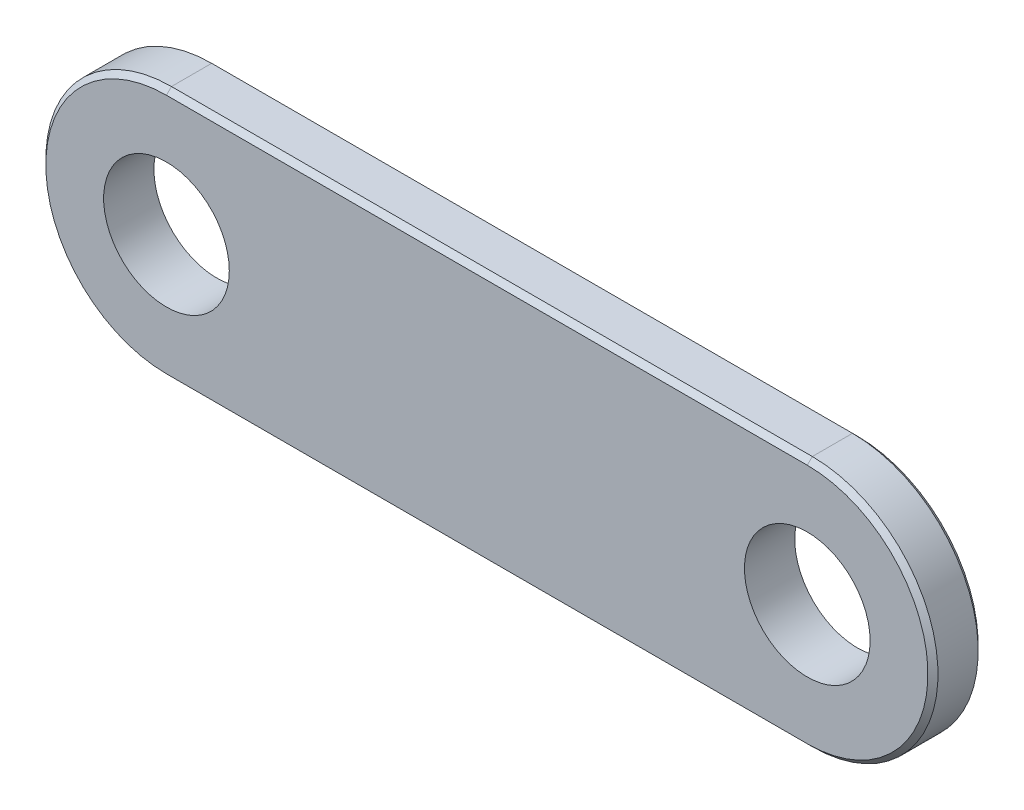
ISO-10303-21;
HEADER;
FILE_DESCRIPTION(('STEP AP214'),'2;1');
FILE_NAME('part.step','',(''),(''),'','','');
FILE_SCHEMA(('AUTOMOTIVE_DESIGN { 1 0 10303 214 1 1 1 1 }'));
ENDSEC;
DATA;
#1=APPLICATION_CONTEXT('core data for automotive mechanical design processes');
#2=APPLICATION_PROTOCOL_DEFINITION('international standard','automotive_design',2000,#1);
#3=PRODUCT_CONTEXT('',#1,'mechanical');
#4=PRODUCT('Part','Part','',(#3));
#5=PRODUCT_RELATED_PRODUCT_CATEGORY('part','',(#4));
#6=PRODUCT_DEFINITION_FORMATION('','',#4);
#7=PRODUCT_DEFINITION_CONTEXT('part definition',#1,'design');
#8=PRODUCT_DEFINITION('design','',#6,#7);
#9=PRODUCT_DEFINITION_SHAPE('','',#8);
#10=(LENGTH_UNIT() NAMED_UNIT(*) SI_UNIT(.MILLI.,.METRE.));
#11=(NAMED_UNIT(*) PLANE_ANGLE_UNIT() SI_UNIT($,.RADIAN.));
#12=(NAMED_UNIT(*) SI_UNIT($,.STERADIAN.) SOLID_ANGLE_UNIT());
#13=UNCERTAINTY_MEASURE_WITH_UNIT(LENGTH_MEASURE(1.E-05),#10,'distance_accuracy_value','');
#14=(GEOMETRIC_REPRESENTATION_CONTEXT(3) GLOBAL_UNCERTAINTY_ASSIGNED_CONTEXT((#13)) GLOBAL_UNIT_ASSIGNED_CONTEXT((#10,
#11,#12)) REPRESENTATION_CONTEXT('',''));
#15=CARTESIAN_POINT('',(0.,0.,0.));
#16=DIRECTION('',(0.,0.,1.));
#17=DIRECTION('',(1.,0.,0.));
#18=AXIS2_PLACEMENT_3D('',#15,#16,#17);
#19=CARTESIAN_POINT('',(-127.5,0.,20.));
#20=DIRECTION('',(0.,0.,1.));
#21=DIRECTION('',(1.,0.,0.));
#22=AXIS2_PLACEMENT_3D('',#19,#20,#21);
#23=PLANE('',#22);
#24=DIRECTION('',(1.,0.,0.));
#25=VECTOR('',#24,1.);
#26=CARTESIAN_POINT('',(127.5,-47.9999999999999,20.));
#27=LINE('',#26,#25);
#28=CARTESIAN_POINT('',(-127.5,-47.9999999999999,20.));
#29=VERTEX_POINT('',#28);
#30=CARTESIAN_POINT('',(127.5,-47.9999999999999,20.));
#31=VERTEX_POINT('',#30);
#32=EDGE_CURVE('E114',#29,#31,#27,.T.);
#33=ORIENTED_EDGE('',*,*,#32,.T.);
#34=CARTESIAN_POINT('',(127.5,0.,20.));
#35=DIRECTION('',(0.,0.,1.));
#36=DIRECTION('',(1.,0.,0.));
#37=AXIS2_PLACEMENT_3D('',#34,#35,#36);
#38=CIRCLE('',#37,48.);
#39=CARTESIAN_POINT('',(127.5,48.,20.));
#40=VERTEX_POINT('',#39);
#41=EDGE_CURVE('E110',#31,#40,#38,.T.);
#42=ORIENTED_EDGE('',*,*,#41,.T.);
#43=DIRECTION('',(-1.,0.,0.));
#44=VECTOR('',#43,1.);
#45=CARTESIAN_POINT('',(-127.5,48.,20.));
#46=LINE('',#45,#44);
#47=CARTESIAN_POINT('',(-127.5,47.9999999999999,20.));
#48=VERTEX_POINT('',#47);
#49=EDGE_CURVE('E104',#40,#48,#46,.T.);
#50=ORIENTED_EDGE('',*,*,#49,.T.);
#51=CARTESIAN_POINT('',(-127.5,0.,20.));
#52=DIRECTION('',(0.,0.,1.));
#53=DIRECTION('',(1.,0.,0.));
#54=AXIS2_PLACEMENT_3D('',#51,#52,#53);
#55=CIRCLE('',#54,47.9999999999999);
#56=EDGE_CURVE('E107',#48,#29,#55,.T.);
#57=ORIENTED_EDGE('',*,*,#56,.T.);
#58=EDGE_LOOP('',(#33,#42,#50,#57));
#59=FACE_BOUND('',#58,.T.);
#60=CARTESIAN_POINT('',(-127.5,0.,20.));
#61=DIRECTION('',(0.,0.,1.));
#62=DIRECTION('',(1.,0.,0.));
#63=AXIS2_PLACEMENT_3D('',#60,#61,#62);
#64=CIRCLE('',#63,25.);
#65=CARTESIAN_POINT('',(-102.5,0.,20.));
#66=VERTEX_POINT('',#65);
#67=EDGE_CURVE('E186',#66,#66,#64,.T.);
#68=ORIENTED_EDGE('',*,*,#67,.F.);
#69=EDGE_LOOP('',(#68));
#70=FACE_BOUND('',#69,.T.);
#71=CARTESIAN_POINT('',(127.5,0.,20.));
#72=DIRECTION('',(0.,0.,1.));
#73=DIRECTION('',(1.,0.,0.));
#74=AXIS2_PLACEMENT_3D('',#71,#72,#73);
#75=CIRCLE('',#74,25.);
#76=CARTESIAN_POINT('',(152.5,0.,20.));
#77=VERTEX_POINT('',#76);
#78=EDGE_CURVE('E190',#77,#77,#75,.T.);
#79=ORIENTED_EDGE('',*,*,#78,.F.);
#80=EDGE_LOOP('',(#79));
#81=FACE_BOUND('',#80,.T.);
#82=ADVANCED_FACE('F37',(#59,#70,#81),#23,.T.);
#83=CARTESIAN_POINT('',(-127.5,0.,0.));
#84=DIRECTION('',(0.,0.,1.));
#85=DIRECTION('',(1.,0.,0.));
#86=AXIS2_PLACEMENT_3D('',#83,#84,#85);
#87=PLANE('',#86);
#88=DIRECTION('',(1.,0.,0.));
#89=VECTOR('',#88,1.);
#90=CARTESIAN_POINT('',(-127.5,48.,0.));
#91=LINE('',#90,#89);
#92=CARTESIAN_POINT('',(-127.5,47.9999999999999,0.));
#93=VERTEX_POINT('',#92);
#94=CARTESIAN_POINT('',(127.5,48.,0.));
#95=VERTEX_POINT('',#94);
#96=EDGE_CURVE('E46',#93,#95,#91,.T.);
#97=ORIENTED_EDGE('',*,*,#96,.T.);
#98=CARTESIAN_POINT('',(127.5,0.,0.));
#99=DIRECTION('',(0.,0.,1.));
#100=DIRECTION('',(1.,0.,0.));
#101=AXIS2_PLACEMENT_3D('',#98,#99,#100);
#102=CIRCLE('',#101,48.);
#103=CARTESIAN_POINT('',(127.5,-47.9999999999999,0.));
#104=VERTEX_POINT('',#103);
#105=EDGE_CURVE('E11',#95,#104,#102,.F.);
#106=ORIENTED_EDGE('',*,*,#105,.T.);
#107=DIRECTION('',(-1.,0.,0.));
#108=VECTOR('',#107,1.);
#109=CARTESIAN_POINT('',(-127.5,-47.9999999999999,0.));
#110=LINE('',#109,#108);
#111=CARTESIAN_POINT('',(-127.5,-47.9999999999999,0.));
#112=VERTEX_POINT('',#111);
#113=EDGE_CURVE('E152',#104,#112,#110,.T.);
#114=ORIENTED_EDGE('',*,*,#113,.T.);
#115=CARTESIAN_POINT('',(-127.5,0.,0.));
#116=DIRECTION('',(0.,0.,1.));
#117=DIRECTION('',(1.,0.,0.));
#118=AXIS2_PLACEMENT_3D('',#115,#116,#117);
#119=CIRCLE('',#118,47.9999999999999);
#120=EDGE_CURVE('E154',#112,#93,#119,.F.);
#121=ORIENTED_EDGE('',*,*,#120,.T.);
#122=EDGE_LOOP('',(#97,#106,#114,#121));
#123=FACE_BOUND('',#122,.T.);
#124=CARTESIAN_POINT('',(-127.5,0.,0.));
#125=DIRECTION('',(0.,0.,1.));
#126=DIRECTION('',(1.,0.,0.));
#127=AXIS2_PLACEMENT_3D('',#124,#125,#126);
#128=CIRCLE('',#127,25.);
#129=CARTESIAN_POINT('',(-102.5,0.,0.));
#130=VERTEX_POINT('',#129);
#131=EDGE_CURVE('E187',#130,#130,#128,.T.);
#132=ORIENTED_EDGE('',*,*,#131,.T.);
#133=EDGE_LOOP('',(#132));
#134=FACE_BOUND('',#133,.T.);
#135=CARTESIAN_POINT('',(127.5,0.,0.));
#136=DIRECTION('',(0.,0.,1.));
#137=DIRECTION('',(1.,0.,0.));
#138=AXIS2_PLACEMENT_3D('',#135,#136,#137);
#139=CIRCLE('',#138,25.);
#140=CARTESIAN_POINT('',(152.5,0.,0.));
#141=VERTEX_POINT('',#140);
#142=EDGE_CURVE('E131',#141,#141,#139,.T.);
#143=ORIENTED_EDGE('',*,*,#142,.T.);
#144=EDGE_LOOP('',(#143));
#145=FACE_BOUND('',#144,.T.);
#146=ADVANCED_FACE('F202',(#123,#134,#145),#87,.F.);
#147=CARTESIAN_POINT('',(-127.5,0.,20.));
#148=DIRECTION('',(0.,0.,-1.));
#149=DIRECTION('',(-1.,0.,0.));
#150=AXIS2_PLACEMENT_3D('',#147,#148,#149);
#151=CYLINDRICAL_SURFACE('',#150,50.);
#152=DIRECTION('',(0.,0.,-1.));
#153=VECTOR('',#152,1.);
#154=CARTESIAN_POINT('',(-127.5,-50.,20.));
#155=LINE('',#154,#153);
#156=CARTESIAN_POINT('',(-127.5,-50.,18.));
#157=VERTEX_POINT('',#156);
#158=CARTESIAN_POINT('',(-127.5,-50.,2.00000000000004));
#159=VERTEX_POINT('',#158);
#160=EDGE_CURVE('E125',#157,#159,#155,.T.);
#161=ORIENTED_EDGE('',*,*,#160,.F.);
#162=CARTESIAN_POINT('',(-127.5,0.,18.));
#163=DIRECTION('',(0.,0.,1.));
#164=DIRECTION('',(1.,0.,0.));
#165=AXIS2_PLACEMENT_3D('',#162,#163,#164);
#166=CIRCLE('',#165,50.);
#167=CARTESIAN_POINT('',(-127.5,50.,18.));
#168=VERTEX_POINT('',#167);
#169=EDGE_CURVE('E156',#157,#168,#166,.F.);
#170=ORIENTED_EDGE('',*,*,#169,.T.);
#171=DIRECTION('',(0.,0.,-1.));
#172=VECTOR('',#171,1.);
#173=CARTESIAN_POINT('',(-127.5,50.,20.));
#174=LINE('',#173,#172);
#175=CARTESIAN_POINT('',(-127.5,50.,2.00000000000004));
#176=VERTEX_POINT('',#175);
#177=EDGE_CURVE('E183',#168,#176,#174,.T.);
#178=ORIENTED_EDGE('',*,*,#177,.T.);
#179=CARTESIAN_POINT('',(-127.5,0.,2.00000000000004));
#180=DIRECTION('',(0.,0.,1.));
#181=DIRECTION('',(1.,0.,0.));
#182=AXIS2_PLACEMENT_3D('',#179,#180,#181);
#183=CIRCLE('',#182,50.);
#184=EDGE_CURVE('E158',#176,#159,#183,.T.);
#185=ORIENTED_EDGE('',*,*,#184,.T.);
#186=EDGE_LOOP('',(#161,#170,#178,#185));
#187=FACE_BOUND('',#186,.T.);
#188=ADVANCED_FACE('F207',(#187),#151,.T.);
#189=CARTESIAN_POINT('',(-127.5,-50.,20.));
#190=DIRECTION('',(0.,1.,0.));
#191=DIRECTION('',(0.,0.,1.));
#192=AXIS2_PLACEMENT_3D('',#189,#190,#191);
#193=PLANE('',#192);
#194=DIRECTION('',(0.,0.,-1.));
#195=VECTOR('',#194,1.);
#196=CARTESIAN_POINT('',(127.5,-50.,20.));
#197=LINE('',#196,#195);
#198=CARTESIAN_POINT('',(127.5,-50.,18.));
#199=VERTEX_POINT('',#198);
#200=CARTESIAN_POINT('',(127.5,-50.,2.00000000000004));
#201=VERTEX_POINT('',#200);
#202=EDGE_CURVE('E177',#199,#201,#197,.T.);
#203=ORIENTED_EDGE('',*,*,#202,.F.);
#204=DIRECTION('',(-1.,0.,0.));
#205=VECTOR('',#204,1.);
#206=CARTESIAN_POINT('',(-127.5,-50.,18.));
#207=LINE('',#206,#205);
#208=EDGE_CURVE('E160',#199,#157,#207,.T.);
#209=ORIENTED_EDGE('',*,*,#208,.T.);
#210=ORIENTED_EDGE('',*,*,#160,.T.);
#211=DIRECTION('',(1.,0.,0.));
#212=VECTOR('',#211,1.);
#213=CARTESIAN_POINT('',(-127.5,-50.,2.00000000000004));
#214=LINE('',#213,#212);
#215=EDGE_CURVE('E162',#159,#201,#214,.T.);
#216=ORIENTED_EDGE('',*,*,#215,.T.);
#217=EDGE_LOOP('',(#203,#209,#210,#216));
#218=FACE_BOUND('',#217,.T.);
#219=ADVANCED_FACE('F220',(#218),#193,.F.);
#220=CARTESIAN_POINT('',(127.5,0.,20.));
#221=DIRECTION('',(0.,0.,-1.));
#222=DIRECTION('',(-1.,0.,0.));
#223=AXIS2_PLACEMENT_3D('',#220,#221,#222);
#224=CYLINDRICAL_SURFACE('',#223,50.);
#225=DIRECTION('',(0.,0.,-1.));
#226=VECTOR('',#225,1.);
#227=CARTESIAN_POINT('',(127.5,50.0000000000001,20.));
#228=LINE('',#227,#226);
#229=CARTESIAN_POINT('',(127.5,50.0000000000001,18.));
#230=VERTEX_POINT('',#229);
#231=CARTESIAN_POINT('',(127.5,50.0000000000001,2.00000000000004));
#232=VERTEX_POINT('',#231);
#233=EDGE_CURVE('E180',#230,#232,#228,.T.);
#234=ORIENTED_EDGE('',*,*,#233,.F.);
#235=CARTESIAN_POINT('',(127.5,0.,18.));
#236=DIRECTION('',(0.,0.,1.));
#237=DIRECTION('',(1.,0.,0.));
#238=AXIS2_PLACEMENT_3D('',#235,#236,#237);
#239=CIRCLE('',#238,50.);
#240=EDGE_CURVE('E167',#230,#199,#239,.F.);
#241=ORIENTED_EDGE('',*,*,#240,.T.);
#242=ORIENTED_EDGE('',*,*,#202,.T.);
#243=CARTESIAN_POINT('',(127.5,0.,2.00000000000004));
#244=DIRECTION('',(0.,0.,1.));
#245=DIRECTION('',(1.,0.,0.));
#246=AXIS2_PLACEMENT_3D('',#243,#244,#245);
#247=CIRCLE('',#246,50.);
#248=EDGE_CURVE('E170',#201,#232,#247,.T.);
#249=ORIENTED_EDGE('',*,*,#248,.T.);
#250=EDGE_LOOP('',(#234,#241,#242,#249));
#251=FACE_BOUND('',#250,.T.);
#252=ADVANCED_FACE('F216',(#251),#224,.T.);
#253=CARTESIAN_POINT('',(-127.5,50.,20.));
#254=DIRECTION('',(0.,-1.,0.));
#255=DIRECTION('',(1.,0.,0.));
#256=AXIS2_PLACEMENT_3D('',#253,#254,#255);
#257=PLANE('',#256);
#258=ORIENTED_EDGE('',*,*,#177,.F.);
#259=DIRECTION('',(1.,0.,0.));
#260=VECTOR('',#259,1.);
#261=CARTESIAN_POINT('',(127.5,50.0000000000001,18.));
#262=LINE('',#261,#260);
#263=EDGE_CURVE('E128',#168,#230,#262,.T.);
#264=ORIENTED_EDGE('',*,*,#263,.T.);
#265=ORIENTED_EDGE('',*,*,#233,.T.);
#266=DIRECTION('',(-1.,0.,0.));
#267=VECTOR('',#266,1.);
#268=CARTESIAN_POINT('',(-127.5,50.,2.00000000000004));
#269=LINE('',#268,#267);
#270=EDGE_CURVE('E165',#232,#176,#269,.T.);
#271=ORIENTED_EDGE('',*,*,#270,.T.);
#272=EDGE_LOOP('',(#258,#264,#265,#271));
#273=FACE_BOUND('',#272,.T.);
#274=ADVANCED_FACE('F213',(#273),#257,.F.);
#275=CARTESIAN_POINT('',(-127.5,0.,20.));
#276=DIRECTION('',(0.,0.,-1.));
#277=DIRECTION('',(-1.,0.,0.));
#278=AXIS2_PLACEMENT_3D('',#275,#276,#277);
#279=CYLINDRICAL_SURFACE('',#278,25.);
#280=ORIENTED_EDGE('',*,*,#67,.T.);
#281=EDGE_LOOP('',(#280));
#282=FACE_BOUND('',#281,.T.);
#283=ORIENTED_EDGE('',*,*,#131,.F.);
#284=EDGE_LOOP('',(#283));
#285=FACE_BOUND('',#284,.T.);
#286=ADVANCED_FACE('F210',(#282,#285),#279,.F.);
#287=CARTESIAN_POINT('',(127.5,0.,20.));
#288=DIRECTION('',(0.,0.,-1.));
#289=DIRECTION('',(-1.,0.,0.));
#290=AXIS2_PLACEMENT_3D('',#287,#288,#289);
#291=CYLINDRICAL_SURFACE('',#290,25.);
#292=ORIENTED_EDGE('',*,*,#78,.T.);
#293=EDGE_LOOP('',(#292));
#294=FACE_BOUND('',#293,.T.);
#295=ORIENTED_EDGE('',*,*,#142,.F.);
#296=EDGE_LOOP('',(#295));
#297=FACE_BOUND('',#296,.T.);
#298=ADVANCED_FACE('F198',(#294,#297),#291,.F.);
#299=CARTESIAN_POINT('',(-127.5,0.,20.));
#300=DIRECTION('',(0.,0.,-1.));
#301=DIRECTION('',(-1.,0.,0.));
#302=AXIS2_PLACEMENT_3D('',#299,#300,#301);
#303=CONICAL_SURFACE('',#302,47.9999999999999,0.78539816339746);
#304=DIRECTION('',(0.,-0.707106781186556,0.707106781186539));
#305=VECTOR('',#304,1.);
#306=CARTESIAN_POINT('',(-127.5,50.,18.));
#307=LINE('',#306,#305);
#308=EDGE_CURVE('E120',#168,#48,#307,.T.);
#309=ORIENTED_EDGE('',*,*,#308,.F.);
#310=ORIENTED_EDGE('',*,*,#169,.F.);
#311=DIRECTION('',(0.,-0.707106781186556,-0.707106781186539));
#312=VECTOR('',#311,1.);
#313=CARTESIAN_POINT('',(-127.5,-47.9999999999999,20.));
#314=LINE('',#313,#312);
#315=EDGE_CURVE('E123',#29,#157,#314,.T.);
#316=ORIENTED_EDGE('',*,*,#315,.F.);
#317=ORIENTED_EDGE('',*,*,#56,.F.);
#318=EDGE_LOOP('',(#309,#310,#316,#317));
#319=FACE_BOUND('',#318,.T.);
#320=ADVANCED_FACE('F118',(#319),#303,.T.);
#321=CARTESIAN_POINT('',(-127.5,-47.9999999999999,20.));
#322=DIRECTION('',(0.,-0.707106781186539,0.707106781186556));
#323=DIRECTION('',(-1.,0.,0.));
#324=AXIS2_PLACEMENT_3D('',#321,#322,#323);
#325=PLANE('',#324);
#326=ORIENTED_EDGE('',*,*,#315,.T.);
#327=ORIENTED_EDGE('',*,*,#208,.F.);
#328=DIRECTION('',(0.,-0.707106781186556,-0.707106781186539));
#329=VECTOR('',#328,1.);
#330=CARTESIAN_POINT('',(127.5,-47.9999999999999,20.));
#331=LINE('',#330,#329);
#332=EDGE_CURVE('E129',#31,#199,#331,.T.);
#333=ORIENTED_EDGE('',*,*,#332,.F.);
#334=ORIENTED_EDGE('',*,*,#32,.F.);
#335=EDGE_LOOP('',(#326,#327,#333,#334));
#336=FACE_BOUND('',#335,.T.);
#337=ADVANCED_FACE('F233',(#336),#325,.T.);
#338=CARTESIAN_POINT('',(-127.5,48.,20.));
#339=DIRECTION('',(0.,0.707106781186539,0.707106781186556));
#340=DIRECTION('',(1.,0.,0.));
#341=AXIS2_PLACEMENT_3D('',#338,#339,#340);
#342=PLANE('',#341);
#343=ORIENTED_EDGE('',*,*,#308,.T.);
#344=ORIENTED_EDGE('',*,*,#49,.F.);
#345=DIRECTION('',(0.,-0.707106781186556,0.707106781186539));
#346=VECTOR('',#345,1.);
#347=CARTESIAN_POINT('',(127.5,50.0000000000001,18.));
#348=LINE('',#347,#346);
#349=EDGE_CURVE('E133',#230,#40,#348,.T.);
#350=ORIENTED_EDGE('',*,*,#349,.F.);
#351=ORIENTED_EDGE('',*,*,#263,.F.);
#352=EDGE_LOOP('',(#343,#344,#350,#351));
#353=FACE_BOUND('',#352,.T.);
#354=ADVANCED_FACE('F127',(#353),#342,.T.);
#355=CARTESIAN_POINT('',(127.5,0.,20.));
#356=DIRECTION('',(0.,0.,-1.));
#357=DIRECTION('',(-1.,0.,0.));
#358=AXIS2_PLACEMENT_3D('',#355,#356,#357);
#359=CONICAL_SURFACE('',#358,48.,0.78539816339746);
#360=ORIENTED_EDGE('',*,*,#332,.T.);
#361=ORIENTED_EDGE('',*,*,#240,.F.);
#362=ORIENTED_EDGE('',*,*,#349,.T.);
#363=ORIENTED_EDGE('',*,*,#41,.F.);
#364=EDGE_LOOP('',(#360,#361,#362,#363));
#365=FACE_BOUND('',#364,.T.);
#366=ADVANCED_FACE('F228',(#365),#359,.T.);
#367=CARTESIAN_POINT('',(-127.5,0.,2.00000000000004));
#368=DIRECTION('',(0.,0.,1.));
#369=DIRECTION('',(1.,0.,0.));
#370=AXIS2_PLACEMENT_3D('',#367,#368,#369);
#371=CONICAL_SURFACE('',#370,50.,0.785398163397454);
#372=DIRECTION('',(0.,0.707106781186551,0.707106781186544));
#373=VECTOR('',#372,1.);
#374=CARTESIAN_POINT('',(-127.5,47.9999999999999,0.));
#375=LINE('',#374,#373);
#376=EDGE_CURVE('E139',#93,#176,#375,.T.);
#377=ORIENTED_EDGE('',*,*,#376,.F.);
#378=ORIENTED_EDGE('',*,*,#120,.F.);
#379=DIRECTION('',(0.,0.707106781186551,-0.707106781186544));
#380=VECTOR('',#379,1.);
#381=CARTESIAN_POINT('',(-127.5,-50.,2.00000000000004));
#382=LINE('',#381,#380);
#383=EDGE_CURVE('E41',#159,#112,#382,.T.);
#384=ORIENTED_EDGE('',*,*,#383,.F.);
#385=ORIENTED_EDGE('',*,*,#184,.F.);
#386=EDGE_LOOP('',(#377,#378,#384,#385));
#387=FACE_BOUND('',#386,.T.);
#388=ADVANCED_FACE('F39',(#387),#371,.T.);
#389=CARTESIAN_POINT('',(-127.5,-50.,2.00000000000004));
#390=DIRECTION('',(0.,0.707106781186544,0.707106781186551));
#391=DIRECTION('',(1.,0.,0.));
#392=AXIS2_PLACEMENT_3D('',#389,#390,#391);
#393=PLANE('',#392);
#394=ORIENTED_EDGE('',*,*,#383,.T.);
#395=ORIENTED_EDGE('',*,*,#113,.F.);
#396=DIRECTION('',(0.,0.707106781186551,-0.707106781186544));
#397=VECTOR('',#396,1.);
#398=CARTESIAN_POINT('',(127.5,-50.,2.00000000000004));
#399=LINE('',#398,#397);
#400=EDGE_CURVE('E59',#201,#104,#399,.T.);
#401=ORIENTED_EDGE('',*,*,#400,.F.);
#402=ORIENTED_EDGE('',*,*,#215,.F.);
#403=EDGE_LOOP('',(#394,#395,#401,#402));
#404=FACE_BOUND('',#403,.T.);
#405=ADVANCED_FACE('F244',(#404),#393,.F.);
#406=CARTESIAN_POINT('',(-127.5,50.,2.00000000000004));
#407=DIRECTION('',(0.,-0.707106781186544,0.707106781186551));
#408=DIRECTION('',(-1.,0.,0.));
#409=AXIS2_PLACEMENT_3D('',#406,#407,#408);
#410=PLANE('',#409);
#411=ORIENTED_EDGE('',*,*,#376,.T.);
#412=ORIENTED_EDGE('',*,*,#270,.F.);
#413=DIRECTION('',(0.,0.707106781186551,0.707106781186544));
#414=VECTOR('',#413,1.);
#415=CARTESIAN_POINT('',(127.5,48.,0.));
#416=LINE('',#415,#414);
#417=EDGE_CURVE('E137',#95,#232,#416,.T.);
#418=ORIENTED_EDGE('',*,*,#417,.F.);
#419=ORIENTED_EDGE('',*,*,#96,.F.);
#420=EDGE_LOOP('',(#411,#412,#418,#419));
#421=FACE_BOUND('',#420,.T.);
#422=ADVANCED_FACE('F242',(#421),#410,.F.);
#423=CARTESIAN_POINT('',(127.5,0.,2.00000000000004));
#424=DIRECTION('',(0.,0.,1.));
#425=DIRECTION('',(1.,0.,0.));
#426=AXIS2_PLACEMENT_3D('',#423,#424,#425);
#427=CONICAL_SURFACE('',#426,50.,0.785398163397454);
#428=ORIENTED_EDGE('',*,*,#400,.T.);
#429=ORIENTED_EDGE('',*,*,#105,.F.);
#430=ORIENTED_EDGE('',*,*,#417,.T.);
#431=ORIENTED_EDGE('',*,*,#248,.F.);
#432=EDGE_LOOP('',(#428,#429,#430,#431));
#433=FACE_BOUND('',#432,.T.);
#434=ADVANCED_FACE('F239',(#433),#427,.T.);
#435=CLOSED_SHELL('',(#82,#146,#188,#219,#252,#274,#286,#298,#320,#337,#354,#366,#388,#405,#422,#434));
#436=MANIFOLD_SOLID_BREP('B2',#435);
#437=ADVANCED_BREP_SHAPE_REPRESENTATION('',(#18,#436),#14);
#438=SHAPE_DEFINITION_REPRESENTATION(#9,#437);
ENDSEC;
END-ISO-10303-21;
